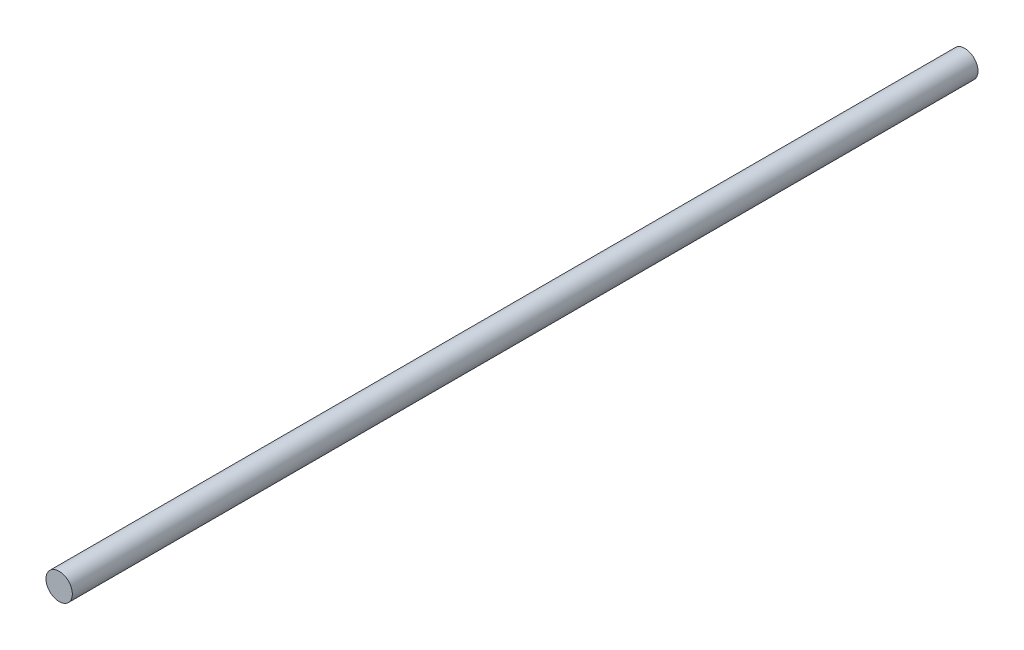
ISO-10303-21;
HEADER;
FILE_DESCRIPTION(('STEP AP214'),'2;1');
FILE_NAME('part.step','',(''),(''),'','','');
FILE_SCHEMA(('AUTOMOTIVE_DESIGN { 1 0 10303 214 1 1 1 1 }'));
ENDSEC;
DATA;
#1=APPLICATION_CONTEXT('core data for automotive mechanical design processes');
#2=APPLICATION_PROTOCOL_DEFINITION('international standard','automotive_design',2000,#1);
#3=PRODUCT_CONTEXT('',#1,'mechanical');
#4=PRODUCT('Part','Part','',(#3));
#5=PRODUCT_RELATED_PRODUCT_CATEGORY('part','',(#4));
#6=PRODUCT_DEFINITION_FORMATION('','',#4);
#7=PRODUCT_DEFINITION_CONTEXT('part definition',#1,'design');
#8=PRODUCT_DEFINITION('design','',#6,#7);
#9=PRODUCT_DEFINITION_SHAPE('','',#8);
#10=(LENGTH_UNIT() NAMED_UNIT(*) SI_UNIT(.MILLI.,.METRE.));
#11=(NAMED_UNIT(*) PLANE_ANGLE_UNIT() SI_UNIT($,.RADIAN.));
#12=(NAMED_UNIT(*) SI_UNIT($,.STERADIAN.) SOLID_ANGLE_UNIT());
#13=UNCERTAINTY_MEASURE_WITH_UNIT(LENGTH_MEASURE(1.E-05),#10,'distance_accuracy_value','');
#14=(GEOMETRIC_REPRESENTATION_CONTEXT(3) GLOBAL_UNCERTAINTY_ASSIGNED_CONTEXT((#13)) GLOBAL_UNIT_ASSIGNED_CONTEXT((#10,
#11,#12)) REPRESENTATION_CONTEXT('',''));
#15=CARTESIAN_POINT('',(0.,0.,0.));
#16=DIRECTION('',(0.,0.,1.));
#17=DIRECTION('',(1.,0.,0.));
#18=AXIS2_PLACEMENT_3D('',#15,#16,#17);
#19=CARTESIAN_POINT('',(0.,0.,-137.5));
#20=DIRECTION('',(0.,0.,1.));
#21=DIRECTION('',(1.,0.,0.));
#22=AXIS2_PLACEMENT_3D('',#19,#20,#21);
#23=CYLINDRICAL_SURFACE('',#22,4.);
#24=CARTESIAN_POINT('',(0.,0.,-137.5));
#25=DIRECTION('',(0.,0.,1.));
#26=DIRECTION('',(1.,0.,0.));
#27=AXIS2_PLACEMENT_3D('',#24,#25,#26);
#28=CIRCLE('',#27,4.);
#29=CARTESIAN_POINT('',(4.,0.,-137.5));
#30=VERTEX_POINT('',#29);
#31=EDGE_CURVE('E10',#30,#30,#28,.T.);
#32=ORIENTED_EDGE('',*,*,#31,.T.);
#33=EDGE_LOOP('',(#32));
#34=FACE_BOUND('',#33,.T.);
#35=CARTESIAN_POINT('',(0.,0.,137.5));
#36=DIRECTION('',(0.,0.,1.));
#37=DIRECTION('',(1.,0.,0.));
#38=AXIS2_PLACEMENT_3D('',#35,#36,#37);
#39=CIRCLE('',#38,4.);
#40=CARTESIAN_POINT('',(4.,0.,137.5));
#41=VERTEX_POINT('',#40);
#42=EDGE_CURVE('E43',#41,#41,#39,.T.);
#43=ORIENTED_EDGE('',*,*,#42,.F.);
#44=EDGE_LOOP('',(#43));
#45=FACE_BOUND('',#44,.T.);
#46=ADVANCED_FACE('F40',(#34,#45),#23,.T.);
#47=CARTESIAN_POINT('',(0.,0.,-137.5));
#48=DIRECTION('',(0.,0.,1.));
#49=DIRECTION('',(1.,0.,0.));
#50=AXIS2_PLACEMENT_3D('',#47,#48,#49);
#51=PLANE('',#50);
#52=ORIENTED_EDGE('',*,*,#31,.F.);
#53=EDGE_LOOP('',(#52));
#54=FACE_BOUND('',#53,.T.);
#55=ADVANCED_FACE('F55',(#54),#51,.F.);
#56=CARTESIAN_POINT('',(0.,0.,137.5));
#57=DIRECTION('',(0.,0.,1.));
#58=DIRECTION('',(1.,0.,0.));
#59=AXIS2_PLACEMENT_3D('',#56,#57,#58);
#60=PLANE('',#59);
#61=ORIENTED_EDGE('',*,*,#42,.T.);
#62=EDGE_LOOP('',(#61));
#63=FACE_BOUND('',#62,.T.);
#64=ADVANCED_FACE('F47',(#63),#60,.T.);
#65=CLOSED_SHELL('',(#46,#55,#64));
#66=MANIFOLD_SOLID_BREP('B2',#65);
#67=ADVANCED_BREP_SHAPE_REPRESENTATION('',(#18,#66),#14);
#68=SHAPE_DEFINITION_REPRESENTATION(#9,#67);
ENDSEC;
END-ISO-10303-21;
